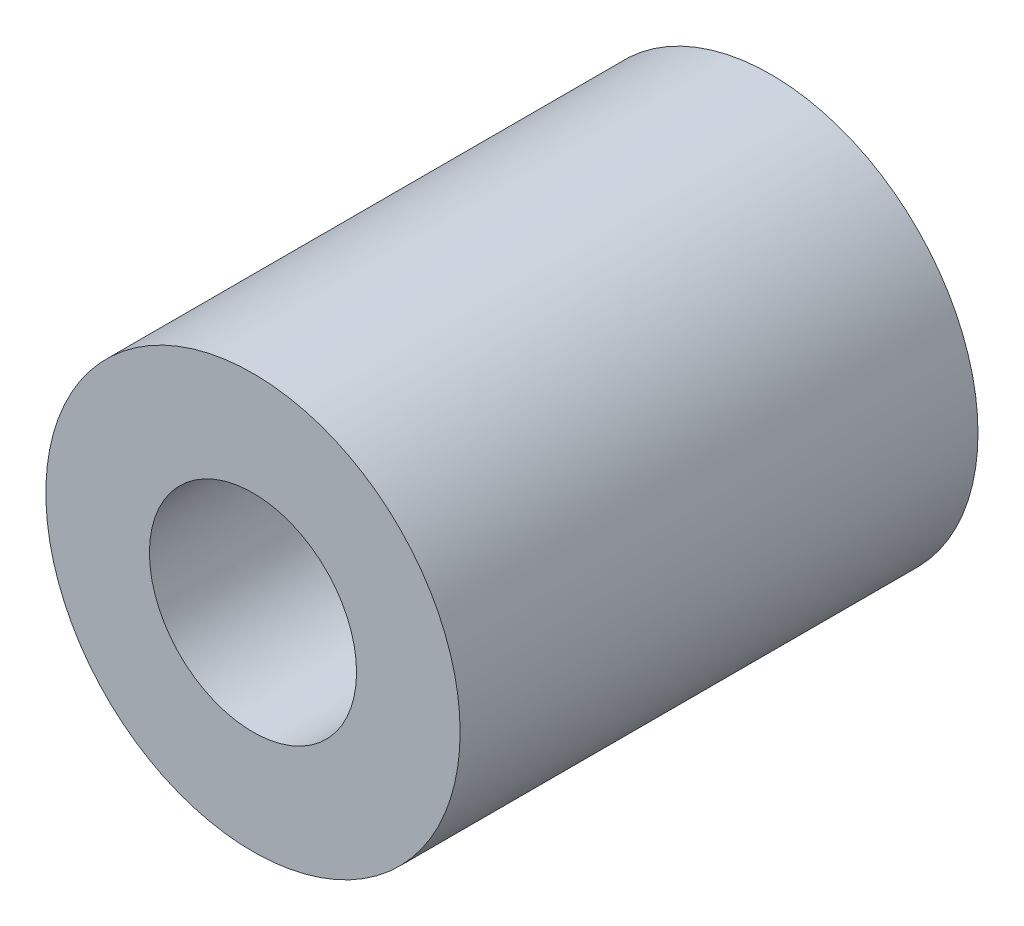
ISO-10303-21;
HEADER;
FILE_DESCRIPTION(('STEP AP214'),'2;1');
FILE_NAME('part.step','',(''),(''),'','','');
FILE_SCHEMA(('AUTOMOTIVE_DESIGN { 1 0 10303 214 1 1 1 1 }'));
ENDSEC;
DATA;
#1=APPLICATION_CONTEXT('core data for automotive mechanical design processes');
#2=APPLICATION_PROTOCOL_DEFINITION('international standard','automotive_design',2000,#1);
#3=PRODUCT_CONTEXT('',#1,'mechanical');
#4=PRODUCT('Part','Part','',(#3));
#5=PRODUCT_RELATED_PRODUCT_CATEGORY('part','',(#4));
#6=PRODUCT_DEFINITION_FORMATION('','',#4);
#7=PRODUCT_DEFINITION_CONTEXT('part definition',#1,'design');
#8=PRODUCT_DEFINITION('design','',#6,#7);
#9=PRODUCT_DEFINITION_SHAPE('','',#8);
#10=(LENGTH_UNIT() NAMED_UNIT(*) SI_UNIT(.MILLI.,.METRE.));
#11=(NAMED_UNIT(*) PLANE_ANGLE_UNIT() SI_UNIT($,.RADIAN.));
#12=(NAMED_UNIT(*) SI_UNIT($,.STERADIAN.) SOLID_ANGLE_UNIT());
#13=UNCERTAINTY_MEASURE_WITH_UNIT(LENGTH_MEASURE(1.E-05),#10,'distance_accuracy_value','');
#14=(GEOMETRIC_REPRESENTATION_CONTEXT(3) GLOBAL_UNCERTAINTY_ASSIGNED_CONTEXT((#13)) GLOBAL_UNIT_ASSIGNED_CONTEXT((#10,
#11,#12)) REPRESENTATION_CONTEXT('',''));
#15=CARTESIAN_POINT('',(0.,0.,0.));
#16=DIRECTION('',(0.,0.,1.));
#17=DIRECTION('',(1.,0.,0.));
#18=AXIS2_PLACEMENT_3D('',#15,#16,#17);
#19=CARTESIAN_POINT('',(0.,0.,5.));
#20=DIRECTION('',(0.,0.,1.));
#21=DIRECTION('',(1.,0.,0.));
#22=AXIS2_PLACEMENT_3D('',#19,#20,#21);
#23=PLANE('',#22);
#24=CARTESIAN_POINT('',(0.,0.,5.));
#25=DIRECTION('',(0.,0.,1.));
#26=DIRECTION('',(1.,0.,0.));
#27=AXIS2_PLACEMENT_3D('',#24,#25,#26);
#28=CIRCLE('',#27,4.);
#29=CARTESIAN_POINT('',(4.,0.,5.));
#30=VERTEX_POINT('',#29);
#31=EDGE_CURVE('E10',#30,#30,#28,.T.);
#32=ORIENTED_EDGE('',*,*,#31,.T.);
#33=EDGE_LOOP('',(#32));
#34=FACE_BOUND('',#33,.T.);
#35=CARTESIAN_POINT('',(0.,0.,5.));
#36=DIRECTION('',(0.,0.,1.));
#37=DIRECTION('',(1.,0.,0.));
#38=AXIS2_PLACEMENT_3D('',#35,#36,#37);
#39=CIRCLE('',#38,2.);
#40=CARTESIAN_POINT('',(2.,0.,5.));
#41=VERTEX_POINT('',#40);
#42=EDGE_CURVE('E44',#41,#41,#39,.T.);
#43=ORIENTED_EDGE('',*,*,#42,.F.);
#44=EDGE_LOOP('',(#43));
#45=FACE_BOUND('',#44,.T.);
#46=ADVANCED_FACE('F33',(#34,#45),#23,.T.);
#47=CARTESIAN_POINT('',(0.,0.,-5.));
#48=DIRECTION('',(0.,0.,1.));
#49=DIRECTION('',(1.,0.,0.));
#50=AXIS2_PLACEMENT_3D('',#47,#48,#49);
#51=PLANE('',#50);
#52=CARTESIAN_POINT('',(0.,0.,-5.));
#53=DIRECTION('',(0.,0.,1.));
#54=DIRECTION('',(1.,0.,0.));
#55=AXIS2_PLACEMENT_3D('',#52,#53,#54);
#56=CIRCLE('',#55,4.);
#57=CARTESIAN_POINT('',(4.,0.,-5.));
#58=VERTEX_POINT('',#57);
#59=EDGE_CURVE('E37',#58,#58,#56,.T.);
#60=ORIENTED_EDGE('',*,*,#59,.F.);
#61=EDGE_LOOP('',(#60));
#62=FACE_BOUND('',#61,.T.);
#63=CARTESIAN_POINT('',(0.,0.,-5.));
#64=DIRECTION('',(0.,0.,1.));
#65=DIRECTION('',(1.,0.,0.));
#66=AXIS2_PLACEMENT_3D('',#63,#64,#65);
#67=CIRCLE('',#66,2.);
#68=CARTESIAN_POINT('',(2.,0.,-5.));
#69=VERTEX_POINT('',#68);
#70=EDGE_CURVE('E46',#69,#69,#67,.T.);
#71=ORIENTED_EDGE('',*,*,#70,.T.);
#72=EDGE_LOOP('',(#71));
#73=FACE_BOUND('',#72,.T.);
#74=ADVANCED_FACE('F56',(#62,#73),#51,.F.);
#75=CARTESIAN_POINT('',(0.,0.,5.));
#76=DIRECTION('',(0.,0.,-1.));
#77=DIRECTION('',(-1.,0.,0.));
#78=AXIS2_PLACEMENT_3D('',#75,#76,#77);
#79=CYLINDRICAL_SURFACE('',#78,4.);
#80=ORIENTED_EDGE('',*,*,#31,.F.);
#81=EDGE_LOOP('',(#80));
#82=FACE_BOUND('',#81,.T.);
#83=ORIENTED_EDGE('',*,*,#59,.T.);
#84=EDGE_LOOP('',(#83));
#85=FACE_BOUND('',#84,.T.);
#86=ADVANCED_FACE('F35',(#82,#85),#79,.T.);
#87=CARTESIAN_POINT('',(0.,0.,5.));
#88=DIRECTION('',(0.,0.,-1.));
#89=DIRECTION('',(-1.,0.,0.));
#90=AXIS2_PLACEMENT_3D('',#87,#88,#89);
#91=CYLINDRICAL_SURFACE('',#90,2.);
#92=ORIENTED_EDGE('',*,*,#42,.T.);
#93=EDGE_LOOP('',(#92));
#94=FACE_BOUND('',#93,.T.);
#95=ORIENTED_EDGE('',*,*,#70,.F.);
#96=EDGE_LOOP('',(#95));
#97=FACE_BOUND('',#96,.T.);
#98=ADVANCED_FACE('F52',(#94,#97),#91,.F.);
#99=CLOSED_SHELL('',(#46,#74,#86,#98));
#100=MANIFOLD_SOLID_BREP('B2',#99);
#101=ADVANCED_BREP_SHAPE_REPRESENTATION('',(#18,#100),#14);
#102=SHAPE_DEFINITION_REPRESENTATION(#9,#101);
ENDSEC;
END-ISO-10303-21;
